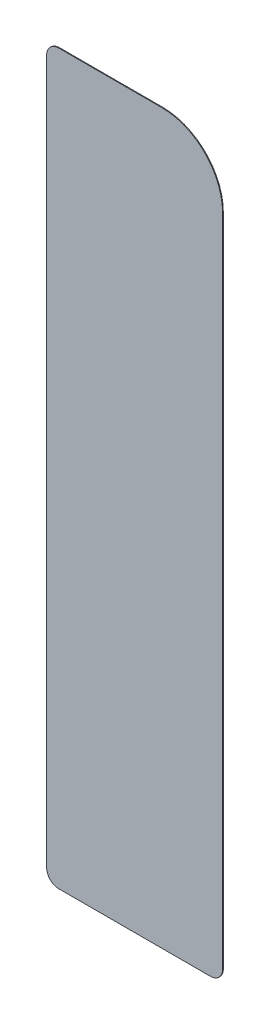
ISO-10303-21;
HEADER;
FILE_DESCRIPTION(('STEP AP214'),'2;1');
FILE_NAME('part.step','',(''),(''),'','','');
FILE_SCHEMA(('AUTOMOTIVE_DESIGN { 1 0 10303 214 1 1 1 1 }'));
ENDSEC;
DATA;
#1=APPLICATION_CONTEXT('core data for automotive mechanical design processes');
#2=APPLICATION_PROTOCOL_DEFINITION('international standard','automotive_design',2000,#1);
#3=PRODUCT_CONTEXT('',#1,'mechanical');
#4=PRODUCT('Part','Part','',(#3));
#5=PRODUCT_RELATED_PRODUCT_CATEGORY('part','',(#4));
#6=PRODUCT_DEFINITION_FORMATION('','',#4);
#7=PRODUCT_DEFINITION_CONTEXT('part definition',#1,'design');
#8=PRODUCT_DEFINITION('design','',#6,#7);
#9=PRODUCT_DEFINITION_SHAPE('','',#8);
#10=(LENGTH_UNIT() NAMED_UNIT(*) SI_UNIT(.MILLI.,.METRE.));
#11=(NAMED_UNIT(*) PLANE_ANGLE_UNIT() SI_UNIT($,.RADIAN.));
#12=(NAMED_UNIT(*) SI_UNIT($,.STERADIAN.) SOLID_ANGLE_UNIT());
#13=UNCERTAINTY_MEASURE_WITH_UNIT(LENGTH_MEASURE(1.E-05),#10,'distance_accuracy_value','');
#14=(GEOMETRIC_REPRESENTATION_CONTEXT(3) GLOBAL_UNCERTAINTY_ASSIGNED_CONTEXT((#13)) GLOBAL_UNIT_ASSIGNED_CONTEXT((#10,
#11,#12)) REPRESENTATION_CONTEXT('',''));
#15=CARTESIAN_POINT('',(0.,0.,0.));
#16=DIRECTION('',(0.,0.,1.));
#17=DIRECTION('',(1.,0.,0.));
#18=AXIS2_PLACEMENT_3D('',#15,#16,#17);
#19=CARTESIAN_POINT('',(12.5,-58.,0.125));
#20=DIRECTION('',(0.,0.,-1.));
#21=DIRECTION('',(-1.,0.,0.));
#22=AXIS2_PLACEMENT_3D('',#19,#20,#21);
#23=CYLINDRICAL_SURFACE('',#22,2.);
#24=CARTESIAN_POINT('',(12.5,-58.,0.));
#25=DIRECTION('',(0.,0.,1.));
#26=DIRECTION('',(1.,0.,0.));
#27=AXIS2_PLACEMENT_3D('',#24,#25,#26);
#28=CIRCLE('',#27,2.);
#29=CARTESIAN_POINT('',(12.5,-60.,0.));
#30=VERTEX_POINT('',#29);
#31=CARTESIAN_POINT('',(14.5,-58.,0.));
#32=VERTEX_POINT('',#31);
#33=EDGE_CURVE('E153',#30,#32,#28,.T.);
#34=ORIENTED_EDGE('',*,*,#33,.T.);
#35=DIRECTION('',(0.,0.,-1.));
#36=VECTOR('',#35,1.);
#37=CARTESIAN_POINT('',(14.5,-58.,0.125));
#38=LINE('',#37,#36);
#39=CARTESIAN_POINT('',(14.5,-58.,0.125));
#40=VERTEX_POINT('',#39);
#41=EDGE_CURVE('E11',#40,#32,#38,.T.);
#42=ORIENTED_EDGE('',*,*,#41,.F.);
#43=CARTESIAN_POINT('',(12.5,-58.,0.125));
#44=DIRECTION('',(0.,0.,1.));
#45=DIRECTION('',(1.,0.,0.));
#46=AXIS2_PLACEMENT_3D('',#43,#44,#45);
#47=CIRCLE('',#46,2.);
#48=CARTESIAN_POINT('',(12.5,-60.,0.125));
#49=VERTEX_POINT('',#48);
#50=EDGE_CURVE('E175',#49,#40,#47,.T.);
#51=ORIENTED_EDGE('',*,*,#50,.F.);
#52=DIRECTION('',(0.,0.,-1.));
#53=VECTOR('',#52,1.);
#54=CARTESIAN_POINT('',(12.5,-60.,0.125));
#55=LINE('',#54,#53);
#56=EDGE_CURVE('E149',#49,#30,#55,.T.);
#57=ORIENTED_EDGE('',*,*,#56,.T.);
#58=EDGE_LOOP('',(#34,#42,#51,#57));
#59=FACE_BOUND('',#58,.T.);
#60=ADVANCED_FACE('F49',(#59),#23,.T.);
#61=CARTESIAN_POINT('',(14.5,50.,0.125));
#62=DIRECTION('',(-1.,0.,0.));
#63=DIRECTION('',(0.,-1.,0.));
#64=AXIS2_PLACEMENT_3D('',#61,#62,#63);
#65=PLANE('',#64);
#66=DIRECTION('',(0.,1.,0.));
#67=VECTOR('',#66,1.);
#68=CARTESIAN_POINT('',(14.5,50.,0.));
#69=LINE('',#68,#67);
#70=CARTESIAN_POINT('',(14.5,50.,0.));
#71=VERTEX_POINT('',#70);
#72=EDGE_CURVE('E157',#32,#71,#69,.T.);
#73=ORIENTED_EDGE('',*,*,#72,.T.);
#74=DIRECTION('',(0.,0.,-1.));
#75=VECTOR('',#74,1.);
#76=CARTESIAN_POINT('',(14.5,50.,0.125));
#77=LINE('',#76,#75);
#78=CARTESIAN_POINT('',(14.5,50.,0.125));
#79=VERTEX_POINT('',#78);
#80=EDGE_CURVE('E58',#79,#71,#77,.T.);
#81=ORIENTED_EDGE('',*,*,#80,.F.);
#82=DIRECTION('',(0.,1.,0.));
#83=VECTOR('',#82,1.);
#84=CARTESIAN_POINT('',(14.5,50.,0.125));
#85=LINE('',#84,#83);
#86=EDGE_CURVE('E109',#40,#79,#85,.T.);
#87=ORIENTED_EDGE('',*,*,#86,.F.);
#88=ORIENTED_EDGE('',*,*,#41,.T.);
#89=EDGE_LOOP('',(#73,#81,#87,#88));
#90=FACE_BOUND('',#89,.T.);
#91=ADVANCED_FACE('F222',(#90),#65,.F.);
#92=CARTESIAN_POINT('',(4.5,50.,0.125));
#93=DIRECTION('',(0.,0.,-1.));
#94=DIRECTION('',(-1.,0.,0.));
#95=AXIS2_PLACEMENT_3D('',#92,#93,#94);
#96=CYLINDRICAL_SURFACE('',#95,10.);
#97=CARTESIAN_POINT('',(4.5,50.,0.));
#98=DIRECTION('',(0.,0.,1.));
#99=DIRECTION('',(-1.,0.,0.));
#100=AXIS2_PLACEMENT_3D('',#97,#98,#99);
#101=CIRCLE('',#100,10.);
#102=CARTESIAN_POINT('',(4.5,60.,0.));
#103=VERTEX_POINT('',#102);
#104=EDGE_CURVE('E160',#71,#103,#101,.T.);
#105=ORIENTED_EDGE('',*,*,#104,.T.);
#106=DIRECTION('',(0.,0.,-1.));
#107=VECTOR('',#106,1.);
#108=CARTESIAN_POINT('',(4.5,60.,0.125));
#109=LINE('',#108,#107);
#110=CARTESIAN_POINT('',(4.5,60.,0.125));
#111=VERTEX_POINT('',#110);
#112=EDGE_CURVE('E185',#111,#103,#109,.T.);
#113=ORIENTED_EDGE('',*,*,#112,.F.);
#114=CARTESIAN_POINT('',(4.5,50.,0.125));
#115=DIRECTION('',(0.,0.,1.));
#116=DIRECTION('',(-1.,0.,0.));
#117=AXIS2_PLACEMENT_3D('',#114,#115,#116);
#118=CIRCLE('',#117,10.);
#119=EDGE_CURVE('E195',#79,#111,#118,.T.);
#120=ORIENTED_EDGE('',*,*,#119,.F.);
#121=ORIENTED_EDGE('',*,*,#80,.T.);
#122=EDGE_LOOP('',(#105,#113,#120,#121));
#123=FACE_BOUND('',#122,.T.);
#124=ADVANCED_FACE('F193',(#123),#96,.T.);
#125=CARTESIAN_POINT('',(-12.5,60.,0.125));
#126=DIRECTION('',(0.,-1.,0.));
#127=DIRECTION('',(1.,0.,0.));
#128=AXIS2_PLACEMENT_3D('',#125,#126,#127);
#129=PLANE('',#128);
#130=DIRECTION('',(-1.,0.,0.));
#131=VECTOR('',#130,1.);
#132=CARTESIAN_POINT('',(-12.5,60.,0.));
#133=LINE('',#132,#131);
#134=CARTESIAN_POINT('',(-12.5,60.,0.));
#135=VERTEX_POINT('',#134);
#136=EDGE_CURVE('E163',#103,#135,#133,.T.);
#137=ORIENTED_EDGE('',*,*,#136,.T.);
#138=DIRECTION('',(0.,0.,-1.));
#139=VECTOR('',#138,1.);
#140=CARTESIAN_POINT('',(-12.5,60.,0.125));
#141=LINE('',#140,#139);
#142=CARTESIAN_POINT('',(-12.5,60.,0.125));
#143=VERTEX_POINT('',#142);
#144=EDGE_CURVE('E181',#143,#135,#141,.T.);
#145=ORIENTED_EDGE('',*,*,#144,.F.);
#146=DIRECTION('',(-1.,0.,0.));
#147=VECTOR('',#146,1.);
#148=CARTESIAN_POINT('',(-12.5,60.,0.125));
#149=LINE('',#148,#147);
#150=EDGE_CURVE('E208',#111,#143,#149,.T.);
#151=ORIENTED_EDGE('',*,*,#150,.F.);
#152=ORIENTED_EDGE('',*,*,#112,.T.);
#153=EDGE_LOOP('',(#137,#145,#151,#152));
#154=FACE_BOUND('',#153,.T.);
#155=ADVANCED_FACE('F203',(#154),#129,.F.);
#156=CARTESIAN_POINT('',(-12.5,58.,0.125));
#157=DIRECTION('',(0.,0.,-1.));
#158=DIRECTION('',(-1.,0.,0.));
#159=AXIS2_PLACEMENT_3D('',#156,#157,#158);
#160=CYLINDRICAL_SURFACE('',#159,2.);
#161=CARTESIAN_POINT('',(-12.5,58.,0.));
#162=DIRECTION('',(0.,0.,1.));
#163=DIRECTION('',(1.,0.,0.));
#164=AXIS2_PLACEMENT_3D('',#161,#162,#163);
#165=CIRCLE('',#164,2.);
#166=CARTESIAN_POINT('',(-14.5,58.,0.));
#167=VERTEX_POINT('',#166);
#168=EDGE_CURVE('E166',#135,#167,#165,.T.);
#169=ORIENTED_EDGE('',*,*,#168,.T.);
#170=DIRECTION('',(0.,0.,-1.));
#171=VECTOR('',#170,1.);
#172=CARTESIAN_POINT('',(-14.5,58.,0.125));
#173=LINE('',#172,#171);
#174=CARTESIAN_POINT('',(-14.5,58.,0.125));
#175=VERTEX_POINT('',#174);
#176=EDGE_CURVE('E139',#175,#167,#173,.T.);
#177=ORIENTED_EDGE('',*,*,#176,.F.);
#178=CARTESIAN_POINT('',(-12.5,58.,0.125));
#179=DIRECTION('',(0.,0.,1.));
#180=DIRECTION('',(1.,0.,0.));
#181=AXIS2_PLACEMENT_3D('',#178,#179,#180);
#182=CIRCLE('',#181,2.);
#183=EDGE_CURVE('E128',#143,#175,#182,.T.);
#184=ORIENTED_EDGE('',*,*,#183,.F.);
#185=ORIENTED_EDGE('',*,*,#144,.T.);
#186=EDGE_LOOP('',(#169,#177,#184,#185));
#187=FACE_BOUND('',#186,.T.);
#188=ADVANCED_FACE('F206',(#187),#160,.T.);
#189=CARTESIAN_POINT('',(-14.5,58.,0.125));
#190=DIRECTION('',(1.,0.,0.));
#191=DIRECTION('',(0.,1.,0.));
#192=AXIS2_PLACEMENT_3D('',#189,#190,#191);
#193=PLANE('',#192);
#194=DIRECTION('',(0.,-1.,0.));
#195=VECTOR('',#194,1.);
#196=CARTESIAN_POINT('',(-14.5,58.,0.));
#197=LINE('',#196,#195);
#198=CARTESIAN_POINT('',(-14.5,-58.,0.));
#199=VERTEX_POINT('',#198);
#200=EDGE_CURVE('E137',#167,#199,#197,.T.);
#201=ORIENTED_EDGE('',*,*,#200,.T.);
#202=DIRECTION('',(0.,0.,-1.));
#203=VECTOR('',#202,1.);
#204=CARTESIAN_POINT('',(-14.5,-58.,0.125));
#205=LINE('',#204,#203);
#206=CARTESIAN_POINT('',(-14.5,-58.,0.125));
#207=VERTEX_POINT('',#206);
#208=EDGE_CURVE('E134',#207,#199,#205,.T.);
#209=ORIENTED_EDGE('',*,*,#208,.F.);
#210=DIRECTION('',(0.,-1.,0.));
#211=VECTOR('',#210,1.);
#212=CARTESIAN_POINT('',(-14.5,58.,0.125));
#213=LINE('',#212,#211);
#214=EDGE_CURVE('E122',#175,#207,#213,.T.);
#215=ORIENTED_EDGE('',*,*,#214,.F.);
#216=ORIENTED_EDGE('',*,*,#176,.T.);
#217=EDGE_LOOP('',(#201,#209,#215,#216));
#218=FACE_BOUND('',#217,.T.);
#219=ADVANCED_FACE('F135',(#218),#193,.F.);
#220=CARTESIAN_POINT('',(-12.5,-58.,0.125));
#221=DIRECTION('',(0.,0.,-1.));
#222=DIRECTION('',(-1.,0.,0.));
#223=AXIS2_PLACEMENT_3D('',#220,#221,#222);
#224=CYLINDRICAL_SURFACE('',#223,2.);
#225=CARTESIAN_POINT('',(-12.5,-58.,0.));
#226=DIRECTION('',(0.,0.,1.));
#227=DIRECTION('',(1.,0.,0.));
#228=AXIS2_PLACEMENT_3D('',#225,#226,#227);
#229=CIRCLE('',#228,2.);
#230=CARTESIAN_POINT('',(-12.5,-60.,0.));
#231=VERTEX_POINT('',#230);
#232=EDGE_CURVE('E95',#199,#231,#229,.T.);
#233=ORIENTED_EDGE('',*,*,#232,.T.);
#234=DIRECTION('',(0.,0.,-1.));
#235=VECTOR('',#234,1.);
#236=CARTESIAN_POINT('',(-12.5,-60.,0.125));
#237=LINE('',#236,#235);
#238=CARTESIAN_POINT('',(-12.5,-60.,0.125));
#239=VERTEX_POINT('',#238);
#240=EDGE_CURVE('E140',#239,#231,#237,.T.);
#241=ORIENTED_EDGE('',*,*,#240,.F.);
#242=CARTESIAN_POINT('',(-12.5,-58.,0.125));
#243=DIRECTION('',(0.,0.,1.));
#244=DIRECTION('',(1.,0.,0.));
#245=AXIS2_PLACEMENT_3D('',#242,#243,#244);
#246=CIRCLE('',#245,2.);
#247=EDGE_CURVE('E126',#207,#239,#246,.T.);
#248=ORIENTED_EDGE('',*,*,#247,.F.);
#249=ORIENTED_EDGE('',*,*,#208,.T.);
#250=EDGE_LOOP('',(#233,#241,#248,#249));
#251=FACE_BOUND('',#250,.T.);
#252=ADVANCED_FACE('F142',(#251),#224,.T.);
#253=CARTESIAN_POINT('',(-12.5,-60.,0.125));
#254=DIRECTION('',(0.,1.,0.));
#255=DIRECTION('',(-1.,0.,0.));
#256=AXIS2_PLACEMENT_3D('',#253,#254,#255);
#257=PLANE('',#256);
#258=DIRECTION('',(1.,0.,0.));
#259=VECTOR('',#258,1.);
#260=CARTESIAN_POINT('',(-12.5,-60.,0.));
#261=LINE('',#260,#259);
#262=EDGE_CURVE('E101',#231,#30,#261,.T.);
#263=ORIENTED_EDGE('',*,*,#262,.T.);
#264=ORIENTED_EDGE('',*,*,#56,.F.);
#265=DIRECTION('',(1.,0.,0.));
#266=VECTOR('',#265,1.);
#267=CARTESIAN_POINT('',(-12.5,-60.,0.125));
#268=LINE('',#267,#266);
#269=EDGE_CURVE('E66',#239,#49,#268,.T.);
#270=ORIENTED_EDGE('',*,*,#269,.F.);
#271=ORIENTED_EDGE('',*,*,#240,.T.);
#272=EDGE_LOOP('',(#263,#264,#270,#271));
#273=FACE_BOUND('',#272,.T.);
#274=ADVANCED_FACE('F237',(#273),#257,.F.);
#275=CARTESIAN_POINT('',(12.5,-58.,0.125));
#276=DIRECTION('',(0.,0.,1.));
#277=DIRECTION('',(1.,0.,0.));
#278=AXIS2_PLACEMENT_3D('',#275,#276,#277);
#279=PLANE('',#278);
#280=ORIENTED_EDGE('',*,*,#50,.T.);
#281=ORIENTED_EDGE('',*,*,#86,.T.);
#282=ORIENTED_EDGE('',*,*,#119,.T.);
#283=ORIENTED_EDGE('',*,*,#150,.T.);
#284=ORIENTED_EDGE('',*,*,#183,.T.);
#285=ORIENTED_EDGE('',*,*,#214,.T.);
#286=ORIENTED_EDGE('',*,*,#247,.T.);
#287=ORIENTED_EDGE('',*,*,#269,.T.);
#288=EDGE_LOOP('',(#280,#281,#282,#283,#284,#285,#286,#287));
#289=FACE_BOUND('',#288,.T.);
#290=ADVANCED_FACE('F124',(#289),#279,.T.);
#291=CARTESIAN_POINT('',(12.5,-58.,0.));
#292=DIRECTION('',(0.,0.,1.));
#293=DIRECTION('',(1.,0.,0.));
#294=AXIS2_PLACEMENT_3D('',#291,#292,#293);
#295=PLANE('',#294);
#296=ORIENTED_EDGE('',*,*,#33,.F.);
#297=ORIENTED_EDGE('',*,*,#262,.F.);
#298=ORIENTED_EDGE('',*,*,#232,.F.);
#299=ORIENTED_EDGE('',*,*,#200,.F.);
#300=ORIENTED_EDGE('',*,*,#168,.F.);
#301=ORIENTED_EDGE('',*,*,#136,.F.);
#302=ORIENTED_EDGE('',*,*,#104,.F.);
#303=ORIENTED_EDGE('',*,*,#72,.F.);
#304=EDGE_LOOP('',(#296,#297,#298,#299,#300,#301,#302,#303));
#305=FACE_BOUND('',#304,.T.);
#306=ADVANCED_FACE('F199',(#305),#295,.F.);
#307=CLOSED_SHELL('',(#60,#91,#124,#155,#188,#219,#252,#274,#290,#306));
#308=MANIFOLD_SOLID_BREP('B2',#307);
#309=ADVANCED_BREP_SHAPE_REPRESENTATION('',(#18,#308),#14);
#310=SHAPE_DEFINITION_REPRESENTATION(#9,#309);
ENDSEC;
END-ISO-10303-21;
